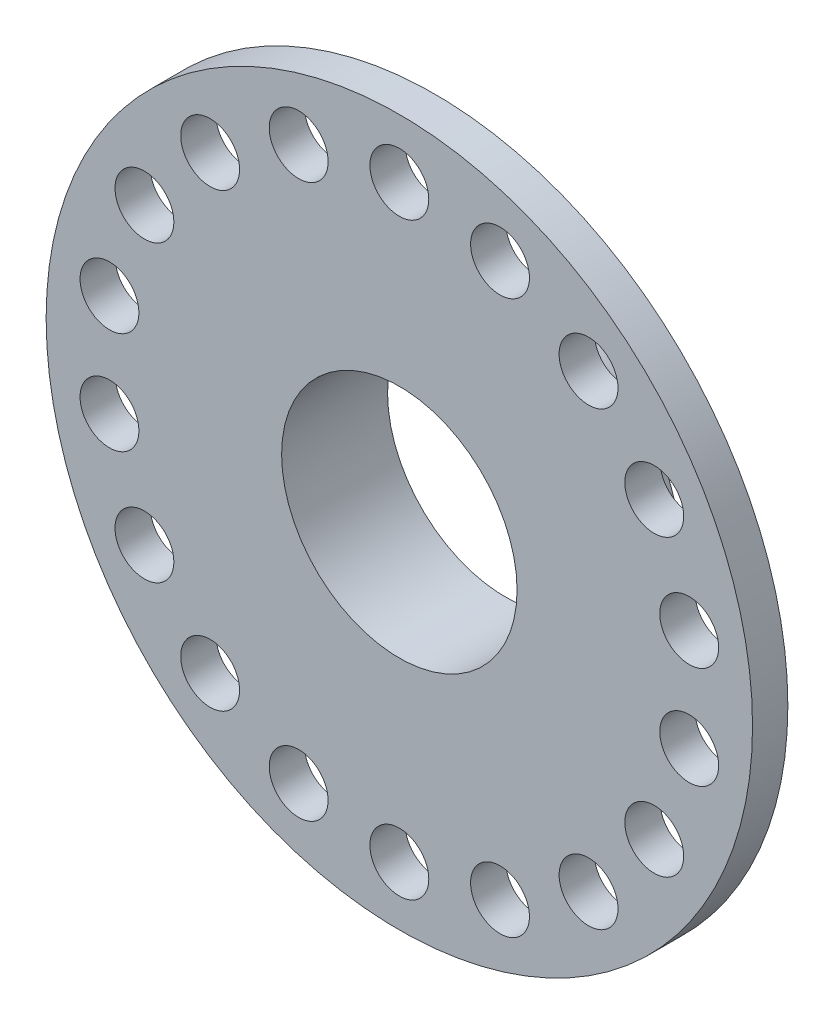
ISO-10303-21;
HEADER;
FILE_DESCRIPTION(('STEP AP214'),'2;1');
FILE_NAME('part.step','',(''),(''),'','','');
FILE_SCHEMA(('AUTOMOTIVE_DESIGN { 1 0 10303 214 1 1 1 1 }'));
ENDSEC;
DATA;
#1=APPLICATION_CONTEXT('core data for automotive mechanical design processes');
#2=APPLICATION_PROTOCOL_DEFINITION('international standard','automotive_design',2000,#1);
#3=PRODUCT_CONTEXT('',#1,'mechanical');
#4=PRODUCT('Part','Part','',(#3));
#5=PRODUCT_RELATED_PRODUCT_CATEGORY('part','',(#4));
#6=PRODUCT_DEFINITION_FORMATION('','',#4);
#7=PRODUCT_DEFINITION_CONTEXT('part definition',#1,'design');
#8=PRODUCT_DEFINITION('design','',#6,#7);
#9=PRODUCT_DEFINITION_SHAPE('','',#8);
#10=(LENGTH_UNIT() NAMED_UNIT(*) SI_UNIT(.MILLI.,.METRE.));
#11=(NAMED_UNIT(*) PLANE_ANGLE_UNIT() SI_UNIT($,.RADIAN.));
#12=(NAMED_UNIT(*) SI_UNIT($,.STERADIAN.) SOLID_ANGLE_UNIT());
#13=UNCERTAINTY_MEASURE_WITH_UNIT(LENGTH_MEASURE(1.E-05),#10,'distance_accuracy_value','');
#14=(GEOMETRIC_REPRESENTATION_CONTEXT(3) GLOBAL_UNCERTAINTY_ASSIGNED_CONTEXT((#13)) GLOBAL_UNIT_ASSIGNED_CONTEXT((#10,
#11,#12)) REPRESENTATION_CONTEXT('',''));
#15=CARTESIAN_POINT('',(0.,0.,0.));
#16=DIRECTION('',(0.,0.,1.));
#17=DIRECTION('',(1.,0.,0.));
#18=AXIS2_PLACEMENT_3D('',#15,#16,#17);
#19=CARTESIAN_POINT('',(0.,0.,6.));
#20=DIRECTION('',(0.,0.,-1.));
#21=DIRECTION('',(-1.,0.,0.));
#22=AXIS2_PLACEMENT_3D('',#19,#20,#21);
#23=CYLINDRICAL_SURFACE('',#22,15.);
#24=CARTESIAN_POINT('',(0.,0.,6.));
#25=DIRECTION('',(0.,0.,1.));
#26=DIRECTION('',(1.,0.,0.));
#27=AXIS2_PLACEMENT_3D('',#24,#25,#26);
#28=CIRCLE('',#27,15.);
#29=CARTESIAN_POINT('',(15.,0.,6.));
#30=VERTEX_POINT('',#29);
#31=EDGE_CURVE('E10',#30,#30,#28,.T.);
#32=ORIENTED_EDGE('',*,*,#31,.F.);
#33=EDGE_LOOP('',(#32));
#34=FACE_BOUND('',#33,.T.);
#35=CARTESIAN_POINT('',(0.,0.,0.));
#36=DIRECTION('',(0.,0.,1.));
#37=DIRECTION('',(1.,0.,0.));
#38=AXIS2_PLACEMENT_3D('',#35,#36,#37);
#39=CIRCLE('',#38,15.);
#40=CARTESIAN_POINT('',(15.,0.,0.));
#41=VERTEX_POINT('',#40);
#42=EDGE_CURVE('E46',#41,#41,#39,.T.);
#43=ORIENTED_EDGE('',*,*,#42,.T.);
#44=EDGE_LOOP('',(#43));
#45=FACE_BOUND('',#44,.T.);
#46=ADVANCED_FACE('F39',(#34,#45),#23,.T.);
#47=CARTESIAN_POINT('',(0.,0.,0.));
#48=DIRECTION('',(0.,0.,1.));
#49=DIRECTION('',(1.,0.,0.));
#50=AXIS2_PLACEMENT_3D('',#47,#48,#49);
#51=PLANE('',#50);
#52=CARTESIAN_POINT('',(0.,0.,0.));
#53=DIRECTION('',(0.,0.,-1.));
#54=DIRECTION('',(-1.,0.,0.));
#55=AXIS2_PLACEMENT_3D('',#52,#53,#54);
#56=CIRCLE('',#55,10.);
#57=CARTESIAN_POINT('',(-10.,0.,0.));
#58=VERTEX_POINT('',#57);
#59=EDGE_CURVE('E110',#58,#58,#56,.T.);
#60=ORIENTED_EDGE('',*,*,#59,.F.);
#61=EDGE_LOOP('',(#60));
#62=FACE_BOUND('',#61,.T.);
#63=ORIENTED_EDGE('',*,*,#42,.F.);
#64=EDGE_LOOP('',(#63));
#65=FACE_BOUND('',#64,.T.);
#66=ADVANCED_FACE('F145',(#62,#65),#51,.F.);
#67=CARTESIAN_POINT('',(0.,0.,9.));
#68=DIRECTION('',(0.,0.,-1.));
#69=DIRECTION('',(-1.,0.,0.));
#70=AXIS2_PLACEMENT_3D('',#67,#68,#69);
#71=CYLINDRICAL_SURFACE('',#70,30.);
#72=CARTESIAN_POINT('',(0.,0.,9.));
#73=DIRECTION('',(0.,0.,1.));
#74=DIRECTION('',(1.,0.,0.));
#75=AXIS2_PLACEMENT_3D('',#72,#73,#74);
#76=CIRCLE('',#75,30.);
#77=CARTESIAN_POINT('',(30.,0.,9.));
#78=VERTEX_POINT('',#77);
#79=EDGE_CURVE('E51',#78,#78,#76,.T.);
#80=ORIENTED_EDGE('',*,*,#79,.F.);
#81=EDGE_LOOP('',(#80));
#82=FACE_BOUND('',#81,.T.);
#83=CARTESIAN_POINT('',(0.,0.,6.));
#84=DIRECTION('',(0.,0.,1.));
#85=DIRECTION('',(1.,0.,0.));
#86=AXIS2_PLACEMENT_3D('',#83,#84,#85);
#87=CIRCLE('',#86,30.);
#88=CARTESIAN_POINT('',(30.,0.,6.));
#89=VERTEX_POINT('',#88);
#90=EDGE_CURVE('E54',#89,#89,#87,.T.);
#91=ORIENTED_EDGE('',*,*,#90,.T.);
#92=EDGE_LOOP('',(#91));
#93=FACE_BOUND('',#92,.T.);
#94=ADVANCED_FACE('F127',(#82,#93),#71,.T.);
#95=CARTESIAN_POINT('',(0.,0.,9.));
#96=DIRECTION('',(0.,0.,1.));
#97=DIRECTION('',(1.,0.,0.));
#98=AXIS2_PLACEMENT_3D('',#95,#96,#97);
#99=PLANE('',#98);
#100=CARTESIAN_POINT('',(8.55050358314173,23.4923155196477,9.));
#101=DIRECTION('',(0.,0.,1.));
#102=DIRECTION('',(1.,0.,0.));
#103=AXIS2_PLACEMENT_3D('',#100,#101,#102);
#104=CIRCLE('',#103,2.5);
#105=CARTESIAN_POINT('',(11.0505035831417,23.4923155196477,9.));
#106=VERTEX_POINT('',#105);
#107=EDGE_CURVE('E417',#106,#106,#104,.T.);
#108=ORIENTED_EDGE('',*,*,#107,.F.);
#109=EDGE_LOOP('',(#108));
#110=FACE_BOUND('',#109,.T.);
#111=CARTESIAN_POINT('',(16.0696902421635,19.1511110779744,9.));
#112=DIRECTION('',(0.,0.,1.));
#113=DIRECTION('',(1.,0.,0.));
#114=AXIS2_PLACEMENT_3D('',#111,#112,#113);
#115=CIRCLE('',#114,2.5);
#116=CARTESIAN_POINT('',(18.5696902421635,19.1511110779744,9.));
#117=VERTEX_POINT('',#116);
#118=EDGE_CURVE('E418',#117,#117,#115,.T.);
#119=ORIENTED_EDGE('',*,*,#118,.F.);
#120=EDGE_LOOP('',(#119));
#121=FACE_BOUND('',#120,.T.);
#122=CARTESIAN_POINT('',(21.650635094611,12.5,9.));
#123=DIRECTION('',(0.,0.,1.));
#124=DIRECTION('',(1.,0.,0.));
#125=AXIS2_PLACEMENT_3D('',#122,#123,#124);
#126=CIRCLE('',#125,2.5);
#127=CARTESIAN_POINT('',(24.150635094611,12.5,9.));
#128=VERTEX_POINT('',#127);
#129=EDGE_CURVE('E422',#128,#128,#126,.T.);
#130=ORIENTED_EDGE('',*,*,#129,.F.);
#131=EDGE_LOOP('',(#130));
#132=FACE_BOUND('',#131,.T.);
#133=CARTESIAN_POINT('',(24.6201938253052,4.34120444167318,9.));
#134=DIRECTION('',(0.,0.,1.));
#135=DIRECTION('',(1.,0.,0.));
#136=AXIS2_PLACEMENT_3D('',#133,#134,#135);
#137=CIRCLE('',#136,2.5);
#138=CARTESIAN_POINT('',(27.1201938253052,4.34120444167318,9.));
#139=VERTEX_POINT('',#138);
#140=EDGE_CURVE('E429',#139,#139,#137,.T.);
#141=ORIENTED_EDGE('',*,*,#140,.F.);
#142=EDGE_LOOP('',(#141));
#143=FACE_BOUND('',#142,.T.);
#144=CARTESIAN_POINT('',(24.6201938253052,-4.34120444167335,9.));
#145=DIRECTION('',(0.,0.,1.));
#146=DIRECTION('',(1.,0.,0.));
#147=AXIS2_PLACEMENT_3D('',#144,#145,#146);
#148=CIRCLE('',#147,2.5);
#149=CARTESIAN_POINT('',(27.1201938253052,-4.34120444167335,9.));
#150=VERTEX_POINT('',#149);
#151=EDGE_CURVE('E432',#150,#150,#148,.T.);
#152=ORIENTED_EDGE('',*,*,#151,.F.);
#153=EDGE_LOOP('',(#152));
#154=FACE_BOUND('',#153,.T.);
#155=CARTESIAN_POINT('',(21.6506350946109,-12.5000000000001,9.));
#156=DIRECTION('',(0.,0.,1.));
#157=DIRECTION('',(1.,0.,0.));
#158=AXIS2_PLACEMENT_3D('',#155,#156,#157);
#159=CIRCLE('',#158,2.5);
#160=CARTESIAN_POINT('',(24.1506350946109,-12.5000000000001,9.));
#161=VERTEX_POINT('',#160);
#162=EDGE_CURVE('E435',#161,#161,#159,.T.);
#163=ORIENTED_EDGE('',*,*,#162,.F.);
#164=EDGE_LOOP('',(#163));
#165=FACE_BOUND('',#164,.T.);
#166=CARTESIAN_POINT('',(16.0696902421634,-19.1511110779745,9.));
#167=DIRECTION('',(0.,0.,1.));
#168=DIRECTION('',(1.,0.,0.));
#169=AXIS2_PLACEMENT_3D('',#166,#167,#168);
#170=CIRCLE('',#169,2.5);
#171=CARTESIAN_POINT('',(18.5696902421634,-19.1511110779745,9.));
#172=VERTEX_POINT('',#171);
#173=EDGE_CURVE('E438',#172,#172,#170,.T.);
#174=ORIENTED_EDGE('',*,*,#173,.F.);
#175=EDGE_LOOP('',(#174));
#176=FACE_BOUND('',#175,.T.);
#177=CARTESIAN_POINT('',(8.55050358314158,-23.4923155196478,9.));
#178=DIRECTION('',(0.,0.,1.));
#179=DIRECTION('',(1.,0.,0.));
#180=AXIS2_PLACEMENT_3D('',#177,#178,#179);
#181=CIRCLE('',#180,2.5);
#182=CARTESIAN_POINT('',(11.0505035831416,-23.4923155196478,9.));
#183=VERTEX_POINT('',#182);
#184=EDGE_CURVE('E441',#183,#183,#181,.T.);
#185=ORIENTED_EDGE('',*,*,#184,.F.);
#186=EDGE_LOOP('',(#185));
#187=FACE_BOUND('',#186,.T.);
#188=CARTESIAN_POINT('',(-1.74574066942157E-13,-25.,9.));
#189=DIRECTION('',(0.,0.,1.));
#190=DIRECTION('',(1.,0.,0.));
#191=AXIS2_PLACEMENT_3D('',#188,#189,#190);
#192=CIRCLE('',#191,2.5);
#193=CARTESIAN_POINT('',(2.49999999999982,-25.,9.));
#194=VERTEX_POINT('',#193);
#195=EDGE_CURVE('E444',#194,#194,#192,.T.);
#196=ORIENTED_EDGE('',*,*,#195,.F.);
#197=EDGE_LOOP('',(#196));
#198=FACE_BOUND('',#197,.T.);
#199=CARTESIAN_POINT('',(-8.5505035831419,-23.4923155196476,9.));
#200=DIRECTION('',(0.,0.,1.));
#201=DIRECTION('',(1.,0.,0.));
#202=AXIS2_PLACEMENT_3D('',#199,#200,#201);
#203=CIRCLE('',#202,2.5);
#204=CARTESIAN_POINT('',(-6.0505035831419,-23.4923155196476,9.));
#205=VERTEX_POINT('',#204);
#206=EDGE_CURVE('E447',#205,#205,#203,.T.);
#207=ORIENTED_EDGE('',*,*,#206,.F.);
#208=EDGE_LOOP('',(#207));
#209=FACE_BOUND('',#208,.T.);
#210=CARTESIAN_POINT('',(-16.0696902421637,-19.1511110779743,9.));
#211=DIRECTION('',(0.,0.,1.));
#212=DIRECTION('',(1.,0.,0.));
#213=AXIS2_PLACEMENT_3D('',#210,#211,#212);
#214=CIRCLE('',#213,2.5);
#215=CARTESIAN_POINT('',(-13.5696902421636,-19.1511110779743,9.));
#216=VERTEX_POINT('',#215);
#217=EDGE_CURVE('E450',#216,#216,#214,.T.);
#218=ORIENTED_EDGE('',*,*,#217,.F.);
#219=EDGE_LOOP('',(#218));
#220=FACE_BOUND('',#219,.T.);
#221=CARTESIAN_POINT('',(-21.6506350946111,-12.4999999999998,9.));
#222=DIRECTION('',(0.,0.,1.));
#223=DIRECTION('',(1.,0.,0.));
#224=AXIS2_PLACEMENT_3D('',#221,#222,#223);
#225=CIRCLE('',#224,2.5);
#226=CARTESIAN_POINT('',(-19.1506350946111,-12.4999999999998,9.));
#227=VERTEX_POINT('',#226);
#228=EDGE_CURVE('E453',#227,#227,#225,.T.);
#229=ORIENTED_EDGE('',*,*,#228,.F.);
#230=EDGE_LOOP('',(#229));
#231=FACE_BOUND('',#230,.T.);
#232=CARTESIAN_POINT('',(-24.6201938253052,-4.34120444167302,9.));
#233=DIRECTION('',(0.,0.,1.));
#234=DIRECTION('',(1.,0.,0.));
#235=AXIS2_PLACEMENT_3D('',#232,#233,#234);
#236=CIRCLE('',#235,2.5);
#237=CARTESIAN_POINT('',(-22.1201938253052,-4.34120444167302,9.));
#238=VERTEX_POINT('',#237);
#239=EDGE_CURVE('E456',#238,#238,#236,.T.);
#240=ORIENTED_EDGE('',*,*,#239,.F.);
#241=EDGE_LOOP('',(#240));
#242=FACE_BOUND('',#241,.T.);
#243=CARTESIAN_POINT('',(-24.6201938253052,4.34120444167351,9.));
#244=DIRECTION('',(0.,0.,1.));
#245=DIRECTION('',(1.,0.,0.));
#246=AXIS2_PLACEMENT_3D('',#243,#244,#245);
#247=CIRCLE('',#246,2.5);
#248=CARTESIAN_POINT('',(-22.1201938253052,4.34120444167351,9.));
#249=VERTEX_POINT('',#248);
#250=EDGE_CURVE('E459',#249,#249,#247,.T.);
#251=ORIENTED_EDGE('',*,*,#250,.F.);
#252=EDGE_LOOP('',(#251));
#253=FACE_BOUND('',#252,.T.);
#254=CARTESIAN_POINT('',(-21.6506350946108,12.5000000000003,9.));
#255=DIRECTION('',(0.,0.,1.));
#256=DIRECTION('',(1.,0.,0.));
#257=AXIS2_PLACEMENT_3D('',#254,#255,#256);
#258=CIRCLE('',#257,2.5);
#259=CARTESIAN_POINT('',(-19.1506350946108,12.5000000000003,9.));
#260=VERTEX_POINT('',#259);
#261=EDGE_CURVE('E462',#260,#260,#258,.T.);
#262=ORIENTED_EDGE('',*,*,#261,.F.);
#263=EDGE_LOOP('',(#262));
#264=FACE_BOUND('',#263,.T.);
#265=CARTESIAN_POINT('',(-16.0696902421633,19.1511110779747,9.));
#266=DIRECTION('',(0.,0.,1.));
#267=DIRECTION('',(1.,0.,0.));
#268=AXIS2_PLACEMENT_3D('',#265,#266,#267);
#269=CIRCLE('',#268,2.5);
#270=CARTESIAN_POINT('',(-13.5696902421633,19.1511110779747,9.));
#271=VERTEX_POINT('',#270);
#272=EDGE_CURVE('E465',#271,#271,#269,.T.);
#273=ORIENTED_EDGE('',*,*,#272,.F.);
#274=EDGE_LOOP('',(#273));
#275=FACE_BOUND('',#274,.T.);
#276=CARTESIAN_POINT('',(-8.55050358314142,23.4923155196478,9.));
#277=DIRECTION('',(0.,0.,1.));
#278=DIRECTION('',(1.,0.,0.));
#279=AXIS2_PLACEMENT_3D('',#276,#277,#278);
#280=CIRCLE('',#279,2.5);
#281=CARTESIAN_POINT('',(-6.05050358314142,23.4923155196478,9.));
#282=VERTEX_POINT('',#281);
#283=EDGE_CURVE('E425',#282,#282,#280,.T.);
#284=ORIENTED_EDGE('',*,*,#283,.F.);
#285=EDGE_LOOP('',(#284));
#286=FACE_BOUND('',#285,.T.);
#287=CARTESIAN_POINT('',(0.,25.,9.));
#288=DIRECTION('',(0.,0.,1.));
#289=DIRECTION('',(1.,0.,0.));
#290=AXIS2_PLACEMENT_3D('',#287,#288,#289);
#291=CIRCLE('',#290,2.5);
#292=CARTESIAN_POINT('',(2.5,25.,9.));
#293=VERTEX_POINT('',#292);
#294=EDGE_CURVE('E61',#293,#293,#291,.T.);
#295=ORIENTED_EDGE('',*,*,#294,.F.);
#296=EDGE_LOOP('',(#295));
#297=FACE_BOUND('',#296,.T.);
#298=CARTESIAN_POINT('',(0.,0.,9.));
#299=DIRECTION('',(0.,0.,-1.));
#300=DIRECTION('',(-1.,0.,0.));
#301=AXIS2_PLACEMENT_3D('',#298,#299,#300);
#302=CIRCLE('',#301,10.);
#303=CARTESIAN_POINT('',(-10.,0.,9.));
#304=VERTEX_POINT('',#303);
#305=EDGE_CURVE('E114',#304,#304,#302,.T.);
#306=ORIENTED_EDGE('',*,*,#305,.T.);
#307=EDGE_LOOP('',(#306));
#308=FACE_BOUND('',#307,.T.);
#309=ORIENTED_EDGE('',*,*,#79,.T.);
#310=EDGE_LOOP('',(#309));
#311=FACE_BOUND('',#310,.T.);
#312=ADVANCED_FACE('F132',(#110,#121,#132,#143,#154,#165,#176,#187,#198,#209,#220,#231,#242,
#253,#264,#275,#286,#297,#308,#311),#99,.T.);
#313=CARTESIAN_POINT('',(0.,0.,6.));
#314=DIRECTION('',(0.,0.,1.));
#315=DIRECTION('',(1.,0.,0.));
#316=AXIS2_PLACEMENT_3D('',#313,#314,#315);
#317=PLANE('',#316);
#318=CARTESIAN_POINT('',(8.55050358314173,23.4923155196477,6.));
#319=DIRECTION('',(0.,0.,1.));
#320=DIRECTION('',(1.,0.,0.));
#321=AXIS2_PLACEMENT_3D('',#318,#319,#320);
#322=CIRCLE('',#321,2.5);
#323=CARTESIAN_POINT('',(11.0505035831417,23.4923155196477,6.));
#324=VERTEX_POINT('',#323);
#325=EDGE_CURVE('E42',#324,#324,#322,.T.);
#326=ORIENTED_EDGE('',*,*,#325,.T.);
#327=EDGE_LOOP('',(#326));
#328=FACE_BOUND('',#327,.T.);
#329=CARTESIAN_POINT('',(16.0696902421635,19.1511110779744,6.));
#330=DIRECTION('',(0.,0.,1.));
#331=DIRECTION('',(1.,0.,0.));
#332=AXIS2_PLACEMENT_3D('',#329,#330,#331);
#333=CIRCLE('',#332,2.5);
#334=CARTESIAN_POINT('',(18.5696902421635,19.1511110779744,6.));
#335=VERTEX_POINT('',#334);
#336=EDGE_CURVE('E105',#335,#335,#333,.T.);
#337=ORIENTED_EDGE('',*,*,#336,.T.);
#338=EDGE_LOOP('',(#337));
#339=FACE_BOUND('',#338,.T.);
#340=CARTESIAN_POINT('',(21.650635094611,12.5,6.));
#341=DIRECTION('',(0.,0.,1.));
#342=DIRECTION('',(1.,0.,0.));
#343=AXIS2_PLACEMENT_3D('',#340,#341,#342);
#344=CIRCLE('',#343,2.5);
#345=CARTESIAN_POINT('',(24.150635094611,12.5,6.));
#346=VERTEX_POINT('',#345);
#347=EDGE_CURVE('E103',#346,#346,#344,.T.);
#348=ORIENTED_EDGE('',*,*,#347,.T.);
#349=EDGE_LOOP('',(#348));
#350=FACE_BOUND('',#349,.T.);
#351=CARTESIAN_POINT('',(24.6201938253052,4.34120444167318,6.));
#352=DIRECTION('',(0.,0.,1.));
#353=DIRECTION('',(1.,0.,0.));
#354=AXIS2_PLACEMENT_3D('',#351,#352,#353);
#355=CIRCLE('',#354,2.5);
#356=CARTESIAN_POINT('',(27.1201938253052,4.34120444167318,6.));
#357=VERTEX_POINT('',#356);
#358=EDGE_CURVE('E100',#357,#357,#355,.T.);
#359=ORIENTED_EDGE('',*,*,#358,.T.);
#360=EDGE_LOOP('',(#359));
#361=FACE_BOUND('',#360,.T.);
#362=CARTESIAN_POINT('',(24.6201938253052,-4.34120444167335,6.));
#363=DIRECTION('',(0.,0.,1.));
#364=DIRECTION('',(1.,0.,0.));
#365=AXIS2_PLACEMENT_3D('',#362,#363,#364);
#366=CIRCLE('',#365,2.5);
#367=CARTESIAN_POINT('',(27.1201938253052,-4.34120444167335,6.));
#368=VERTEX_POINT('',#367);
#369=EDGE_CURVE('E97',#368,#368,#366,.T.);
#370=ORIENTED_EDGE('',*,*,#369,.T.);
#371=EDGE_LOOP('',(#370));
#372=FACE_BOUND('',#371,.T.);
#373=CARTESIAN_POINT('',(21.6506350946109,-12.5000000000001,6.));
#374=DIRECTION('',(0.,0.,1.));
#375=DIRECTION('',(1.,0.,0.));
#376=AXIS2_PLACEMENT_3D('',#373,#374,#375);
#377=CIRCLE('',#376,2.5);
#378=CARTESIAN_POINT('',(24.1506350946109,-12.5000000000001,6.));
#379=VERTEX_POINT('',#378);
#380=EDGE_CURVE('E94',#379,#379,#377,.T.);
#381=ORIENTED_EDGE('',*,*,#380,.T.);
#382=EDGE_LOOP('',(#381));
#383=FACE_BOUND('',#382,.T.);
#384=CARTESIAN_POINT('',(16.0696902421634,-19.1511110779745,6.));
#385=DIRECTION('',(0.,0.,1.));
#386=DIRECTION('',(1.,0.,0.));
#387=AXIS2_PLACEMENT_3D('',#384,#385,#386);
#388=CIRCLE('',#387,2.5);
#389=CARTESIAN_POINT('',(18.5696902421634,-19.1511110779745,6.));
#390=VERTEX_POINT('',#389);
#391=EDGE_CURVE('E91',#390,#390,#388,.T.);
#392=ORIENTED_EDGE('',*,*,#391,.T.);
#393=EDGE_LOOP('',(#392));
#394=FACE_BOUND('',#393,.T.);
#395=CARTESIAN_POINT('',(8.55050358314158,-23.4923155196478,6.));
#396=DIRECTION('',(0.,0.,1.));
#397=DIRECTION('',(1.,0.,0.));
#398=AXIS2_PLACEMENT_3D('',#395,#396,#397);
#399=CIRCLE('',#398,2.5);
#400=CARTESIAN_POINT('',(11.0505035831416,-23.4923155196478,6.));
#401=VERTEX_POINT('',#400);
#402=EDGE_CURVE('E88',#401,#401,#399,.T.);
#403=ORIENTED_EDGE('',*,*,#402,.T.);
#404=EDGE_LOOP('',(#403));
#405=FACE_BOUND('',#404,.T.);
#406=CARTESIAN_POINT('',(-1.74574066942157E-13,-25.,6.));
#407=DIRECTION('',(0.,0.,1.));
#408=DIRECTION('',(1.,0.,0.));
#409=AXIS2_PLACEMENT_3D('',#406,#407,#408);
#410=CIRCLE('',#409,2.5);
#411=CARTESIAN_POINT('',(2.49999999999982,-25.,6.));
#412=VERTEX_POINT('',#411);
#413=EDGE_CURVE('E85',#412,#412,#410,.T.);
#414=ORIENTED_EDGE('',*,*,#413,.T.);
#415=EDGE_LOOP('',(#414));
#416=FACE_BOUND('',#415,.T.);
#417=CARTESIAN_POINT('',(-8.5505035831419,-23.4923155196476,6.));
#418=DIRECTION('',(0.,0.,1.));
#419=DIRECTION('',(1.,0.,0.));
#420=AXIS2_PLACEMENT_3D('',#417,#418,#419);
#421=CIRCLE('',#420,2.5);
#422=CARTESIAN_POINT('',(-6.0505035831419,-23.4923155196476,6.));
#423=VERTEX_POINT('',#422);
#424=EDGE_CURVE('E82',#423,#423,#421,.T.);
#425=ORIENTED_EDGE('',*,*,#424,.T.);
#426=EDGE_LOOP('',(#425));
#427=FACE_BOUND('',#426,.T.);
#428=CARTESIAN_POINT('',(-16.0696902421637,-19.1511110779743,6.));
#429=DIRECTION('',(0.,0.,1.));
#430=DIRECTION('',(1.,0.,0.));
#431=AXIS2_PLACEMENT_3D('',#428,#429,#430);
#432=CIRCLE('',#431,2.5);
#433=CARTESIAN_POINT('',(-13.5696902421636,-19.1511110779743,6.));
#434=VERTEX_POINT('',#433);
#435=EDGE_CURVE('E79',#434,#434,#432,.T.);
#436=ORIENTED_EDGE('',*,*,#435,.T.);
#437=EDGE_LOOP('',(#436));
#438=FACE_BOUND('',#437,.T.);
#439=CARTESIAN_POINT('',(-21.6506350946111,-12.4999999999998,6.));
#440=DIRECTION('',(0.,0.,1.));
#441=DIRECTION('',(1.,0.,0.));
#442=AXIS2_PLACEMENT_3D('',#439,#440,#441);
#443=CIRCLE('',#442,2.5);
#444=CARTESIAN_POINT('',(-19.1506350946111,-12.4999999999998,6.));
#445=VERTEX_POINT('',#444);
#446=EDGE_CURVE('E76',#445,#445,#443,.T.);
#447=ORIENTED_EDGE('',*,*,#446,.T.);
#448=EDGE_LOOP('',(#447));
#449=FACE_BOUND('',#448,.T.);
#450=CARTESIAN_POINT('',(-24.6201938253052,-4.34120444167302,6.));
#451=DIRECTION('',(0.,0.,1.));
#452=DIRECTION('',(1.,0.,0.));
#453=AXIS2_PLACEMENT_3D('',#450,#451,#452);
#454=CIRCLE('',#453,2.5);
#455=CARTESIAN_POINT('',(-22.1201938253052,-4.34120444167302,6.));
#456=VERTEX_POINT('',#455);
#457=EDGE_CURVE('E73',#456,#456,#454,.T.);
#458=ORIENTED_EDGE('',*,*,#457,.T.);
#459=EDGE_LOOP('',(#458));
#460=FACE_BOUND('',#459,.T.);
#461=CARTESIAN_POINT('',(-24.6201938253052,4.34120444167351,6.));
#462=DIRECTION('',(0.,0.,1.));
#463=DIRECTION('',(1.,0.,0.));
#464=AXIS2_PLACEMENT_3D('',#461,#462,#463);
#465=CIRCLE('',#464,2.5);
#466=CARTESIAN_POINT('',(-22.1201938253052,4.34120444167351,6.));
#467=VERTEX_POINT('',#466);
#468=EDGE_CURVE('E70',#467,#467,#465,.T.);
#469=ORIENTED_EDGE('',*,*,#468,.T.);
#470=EDGE_LOOP('',(#469));
#471=FACE_BOUND('',#470,.T.);
#472=CARTESIAN_POINT('',(-21.6506350946108,12.5000000000003,6.));
#473=DIRECTION('',(0.,0.,1.));
#474=DIRECTION('',(1.,0.,0.));
#475=AXIS2_PLACEMENT_3D('',#472,#473,#474);
#476=CIRCLE('',#475,2.5);
#477=CARTESIAN_POINT('',(-19.1506350946108,12.5000000000003,6.));
#478=VERTEX_POINT('',#477);
#479=EDGE_CURVE('E67',#478,#478,#476,.T.);
#480=ORIENTED_EDGE('',*,*,#479,.T.);
#481=EDGE_LOOP('',(#480));
#482=FACE_BOUND('',#481,.T.);
#483=CARTESIAN_POINT('',(-16.0696902421633,19.1511110779747,6.));
#484=DIRECTION('',(0.,0.,1.));
#485=DIRECTION('',(1.,0.,0.));
#486=AXIS2_PLACEMENT_3D('',#483,#484,#485);
#487=CIRCLE('',#486,2.5);
#488=CARTESIAN_POINT('',(-13.5696902421633,19.1511110779747,6.));
#489=VERTEX_POINT('',#488);
#490=EDGE_CURVE('E64',#489,#489,#487,.T.);
#491=ORIENTED_EDGE('',*,*,#490,.T.);
#492=EDGE_LOOP('',(#491));
#493=FACE_BOUND('',#492,.T.);
#494=CARTESIAN_POINT('',(-8.55050358314142,23.4923155196478,6.));
#495=DIRECTION('',(0.,0.,1.));
#496=DIRECTION('',(1.,0.,0.));
#497=AXIS2_PLACEMENT_3D('',#494,#495,#496);
#498=CIRCLE('',#497,2.5);
#499=CARTESIAN_POINT('',(-6.05050358314142,23.4923155196478,6.));
#500=VERTEX_POINT('',#499);
#501=EDGE_CURVE('E60',#500,#500,#498,.T.);
#502=ORIENTED_EDGE('',*,*,#501,.T.);
#503=EDGE_LOOP('',(#502));
#504=FACE_BOUND('',#503,.T.);
#505=CARTESIAN_POINT('',(0.,25.,6.));
#506=DIRECTION('',(0.,0.,1.));
#507=DIRECTION('',(1.,0.,0.));
#508=AXIS2_PLACEMENT_3D('',#505,#506,#507);
#509=CIRCLE('',#508,2.5);
#510=CARTESIAN_POINT('',(2.5,25.,6.));
#511=VERTEX_POINT('',#510);
#512=EDGE_CURVE('E57',#511,#511,#509,.T.);
#513=ORIENTED_EDGE('',*,*,#512,.T.);
#514=EDGE_LOOP('',(#513));
#515=FACE_BOUND('',#514,.T.);
#516=ORIENTED_EDGE('',*,*,#31,.T.);
#517=EDGE_LOOP('',(#516));
#518=FACE_BOUND('',#517,.T.);
#519=ORIENTED_EDGE('',*,*,#90,.F.);
#520=EDGE_LOOP('',(#519));
#521=FACE_BOUND('',#520,.T.);
#522=ADVANCED_FACE('F129',(#328,#339,#350,#361,#372,#383,#394,#405,#416,#427,#438,#449,#460,
#471,#482,#493,#504,#515,#518,#521),#317,.F.);
#523=CARTESIAN_POINT('',(0.,0.,9.));
#524=DIRECTION('',(0.,0.,-1.));
#525=DIRECTION('',(-1.,0.,0.));
#526=AXIS2_PLACEMENT_3D('',#523,#524,#525);
#527=CYLINDRICAL_SURFACE('',#526,10.);
#528=ORIENTED_EDGE('',*,*,#305,.F.);
#529=EDGE_LOOP('',(#528));
#530=FACE_BOUND('',#529,.T.);
#531=ORIENTED_EDGE('',*,*,#59,.T.);
#532=EDGE_LOOP('',(#531));
#533=FACE_BOUND('',#532,.T.);
#534=ADVANCED_FACE('F131',(#530,#533),#527,.F.);
#535=CARTESIAN_POINT('',(0.,25.,0.));
#536=DIRECTION('',(0.,0.,1.));
#537=DIRECTION('',(1.,0.,0.));
#538=AXIS2_PLACEMENT_3D('',#535,#536,#537);
#539=CYLINDRICAL_SURFACE('',#538,2.5);
#540=ORIENTED_EDGE('',*,*,#294,.T.);
#541=EDGE_LOOP('',(#540));
#542=FACE_BOUND('',#541,.T.);
#543=ORIENTED_EDGE('',*,*,#512,.F.);
#544=EDGE_LOOP('',(#543));
#545=FACE_BOUND('',#544,.T.);
#546=ADVANCED_FACE('F138',(#542,#545),#539,.F.);
#547=CARTESIAN_POINT('',(-8.55050358314142,23.4923155196478,0.));
#548=DIRECTION('',(0.,0.,1.));
#549=DIRECTION('',(1.,0.,0.));
#550=AXIS2_PLACEMENT_3D('',#547,#548,#549);
#551=CYLINDRICAL_SURFACE('',#550,2.5);
#552=ORIENTED_EDGE('',*,*,#283,.T.);
#553=EDGE_LOOP('',(#552));
#554=FACE_BOUND('',#553,.T.);
#555=ORIENTED_EDGE('',*,*,#501,.F.);
#556=EDGE_LOOP('',(#555));
#557=FACE_BOUND('',#556,.T.);
#558=ADVANCED_FACE('F182',(#554,#557),#551,.F.);
#559=CARTESIAN_POINT('',(-16.0696902421633,19.1511110779747,0.));
#560=DIRECTION('',(0.,0.,1.));
#561=DIRECTION('',(1.,0.,0.));
#562=AXIS2_PLACEMENT_3D('',#559,#560,#561);
#563=CYLINDRICAL_SURFACE('',#562,2.5);
#564=ORIENTED_EDGE('',*,*,#272,.T.);
#565=EDGE_LOOP('',(#564));
#566=FACE_BOUND('',#565,.T.);
#567=ORIENTED_EDGE('',*,*,#490,.F.);
#568=EDGE_LOOP('',(#567));
#569=FACE_BOUND('',#568,.T.);
#570=ADVANCED_FACE('F193',(#566,#569),#563,.F.);
#571=CARTESIAN_POINT('',(-21.6506350946108,12.5000000000003,0.));
#572=DIRECTION('',(0.,0.,1.));
#573=DIRECTION('',(1.,0.,0.));
#574=AXIS2_PLACEMENT_3D('',#571,#572,#573);
#575=CYLINDRICAL_SURFACE('',#574,2.5);
#576=ORIENTED_EDGE('',*,*,#261,.T.);
#577=EDGE_LOOP('',(#576));
#578=FACE_BOUND('',#577,.T.);
#579=ORIENTED_EDGE('',*,*,#479,.F.);
#580=EDGE_LOOP('',(#579));
#581=FACE_BOUND('',#580,.T.);
#582=ADVANCED_FACE('F204',(#578,#581),#575,.F.);
#583=CARTESIAN_POINT('',(-24.6201938253052,4.34120444167351,0.));
#584=DIRECTION('',(0.,0.,1.));
#585=DIRECTION('',(1.,0.,0.));
#586=AXIS2_PLACEMENT_3D('',#583,#584,#585);
#587=CYLINDRICAL_SURFACE('',#586,2.5);
#588=ORIENTED_EDGE('',*,*,#250,.T.);
#589=EDGE_LOOP('',(#588));
#590=FACE_BOUND('',#589,.T.);
#591=ORIENTED_EDGE('',*,*,#468,.F.);
#592=EDGE_LOOP('',(#591));
#593=FACE_BOUND('',#592,.T.);
#594=ADVANCED_FACE('F215',(#590,#593),#587,.F.);
#595=CARTESIAN_POINT('',(-24.6201938253052,-4.34120444167302,0.));
#596=DIRECTION('',(0.,0.,1.));
#597=DIRECTION('',(1.,0.,0.));
#598=AXIS2_PLACEMENT_3D('',#595,#596,#597);
#599=CYLINDRICAL_SURFACE('',#598,2.5);
#600=ORIENTED_EDGE('',*,*,#239,.T.);
#601=EDGE_LOOP('',(#600));
#602=FACE_BOUND('',#601,.T.);
#603=ORIENTED_EDGE('',*,*,#457,.F.);
#604=EDGE_LOOP('',(#603));
#605=FACE_BOUND('',#604,.T.);
#606=ADVANCED_FACE('F226',(#602,#605),#599,.F.);
#607=CARTESIAN_POINT('',(-21.6506350946111,-12.4999999999998,0.));
#608=DIRECTION('',(0.,0.,1.));
#609=DIRECTION('',(1.,0.,0.));
#610=AXIS2_PLACEMENT_3D('',#607,#608,#609);
#611=CYLINDRICAL_SURFACE('',#610,2.5);
#612=ORIENTED_EDGE('',*,*,#228,.T.);
#613=EDGE_LOOP('',(#612));
#614=FACE_BOUND('',#613,.T.);
#615=ORIENTED_EDGE('',*,*,#446,.F.);
#616=EDGE_LOOP('',(#615));
#617=FACE_BOUND('',#616,.T.);
#618=ADVANCED_FACE('F237',(#614,#617),#611,.F.);
#619=CARTESIAN_POINT('',(-16.0696902421637,-19.1511110779743,0.));
#620=DIRECTION('',(0.,0.,1.));
#621=DIRECTION('',(1.,0.,0.));
#622=AXIS2_PLACEMENT_3D('',#619,#620,#621);
#623=CYLINDRICAL_SURFACE('',#622,2.5);
#624=ORIENTED_EDGE('',*,*,#217,.T.);
#625=EDGE_LOOP('',(#624));
#626=FACE_BOUND('',#625,.T.);
#627=ORIENTED_EDGE('',*,*,#435,.F.);
#628=EDGE_LOOP('',(#627));
#629=FACE_BOUND('',#628,.T.);
#630=ADVANCED_FACE('F248',(#626,#629),#623,.F.);
#631=CARTESIAN_POINT('',(-8.5505035831419,-23.4923155196476,0.));
#632=DIRECTION('',(0.,0.,1.));
#633=DIRECTION('',(1.,0.,0.));
#634=AXIS2_PLACEMENT_3D('',#631,#632,#633);
#635=CYLINDRICAL_SURFACE('',#634,2.5);
#636=ORIENTED_EDGE('',*,*,#206,.T.);
#637=EDGE_LOOP('',(#636));
#638=FACE_BOUND('',#637,.T.);
#639=ORIENTED_EDGE('',*,*,#424,.F.);
#640=EDGE_LOOP('',(#639));
#641=FACE_BOUND('',#640,.T.);
#642=ADVANCED_FACE('F259',(#638,#641),#635,.F.);
#643=CARTESIAN_POINT('',(-1.74574066942157E-13,-25.,0.));
#644=DIRECTION('',(0.,0.,1.));
#645=DIRECTION('',(1.,0.,0.));
#646=AXIS2_PLACEMENT_3D('',#643,#644,#645);
#647=CYLINDRICAL_SURFACE('',#646,2.5);
#648=ORIENTED_EDGE('',*,*,#195,.T.);
#649=EDGE_LOOP('',(#648));
#650=FACE_BOUND('',#649,.T.);
#651=ORIENTED_EDGE('',*,*,#413,.F.);
#652=EDGE_LOOP('',(#651));
#653=FACE_BOUND('',#652,.T.);
#654=ADVANCED_FACE('F270',(#650,#653),#647,.F.);
#655=CARTESIAN_POINT('',(8.55050358314158,-23.4923155196478,0.));
#656=DIRECTION('',(0.,0.,1.));
#657=DIRECTION('',(1.,0.,0.));
#658=AXIS2_PLACEMENT_3D('',#655,#656,#657);
#659=CYLINDRICAL_SURFACE('',#658,2.5);
#660=ORIENTED_EDGE('',*,*,#184,.T.);
#661=EDGE_LOOP('',(#660));
#662=FACE_BOUND('',#661,.T.);
#663=ORIENTED_EDGE('',*,*,#402,.F.);
#664=EDGE_LOOP('',(#663));
#665=FACE_BOUND('',#664,.T.);
#666=ADVANCED_FACE('F281',(#662,#665),#659,.F.);
#667=CARTESIAN_POINT('',(16.0696902421634,-19.1511110779745,0.));
#668=DIRECTION('',(0.,0.,1.));
#669=DIRECTION('',(1.,0.,0.));
#670=AXIS2_PLACEMENT_3D('',#667,#668,#669);
#671=CYLINDRICAL_SURFACE('',#670,2.5);
#672=ORIENTED_EDGE('',*,*,#173,.T.);
#673=EDGE_LOOP('',(#672));
#674=FACE_BOUND('',#673,.T.);
#675=ORIENTED_EDGE('',*,*,#391,.F.);
#676=EDGE_LOOP('',(#675));
#677=FACE_BOUND('',#676,.T.);
#678=ADVANCED_FACE('F292',(#674,#677),#671,.F.);
#679=CARTESIAN_POINT('',(21.6506350946109,-12.5000000000001,0.));
#680=DIRECTION('',(0.,0.,1.));
#681=DIRECTION('',(1.,0.,0.));
#682=AXIS2_PLACEMENT_3D('',#679,#680,#681);
#683=CYLINDRICAL_SURFACE('',#682,2.5);
#684=ORIENTED_EDGE('',*,*,#162,.T.);
#685=EDGE_LOOP('',(#684));
#686=FACE_BOUND('',#685,.T.);
#687=ORIENTED_EDGE('',*,*,#380,.F.);
#688=EDGE_LOOP('',(#687));
#689=FACE_BOUND('',#688,.T.);
#690=ADVANCED_FACE('F303',(#686,#689),#683,.F.);
#691=CARTESIAN_POINT('',(24.6201938253052,-4.34120444167335,0.));
#692=DIRECTION('',(0.,0.,1.));
#693=DIRECTION('',(1.,0.,0.));
#694=AXIS2_PLACEMENT_3D('',#691,#692,#693);
#695=CYLINDRICAL_SURFACE('',#694,2.5);
#696=ORIENTED_EDGE('',*,*,#151,.T.);
#697=EDGE_LOOP('',(#696));
#698=FACE_BOUND('',#697,.T.);
#699=ORIENTED_EDGE('',*,*,#369,.F.);
#700=EDGE_LOOP('',(#699));
#701=FACE_BOUND('',#700,.T.);
#702=ADVANCED_FACE('F314',(#698,#701),#695,.F.);
#703=CARTESIAN_POINT('',(24.6201938253052,4.34120444167318,0.));
#704=DIRECTION('',(0.,0.,1.));
#705=DIRECTION('',(1.,0.,0.));
#706=AXIS2_PLACEMENT_3D('',#703,#704,#705);
#707=CYLINDRICAL_SURFACE('',#706,2.5);
#708=ORIENTED_EDGE('',*,*,#140,.T.);
#709=EDGE_LOOP('',(#708));
#710=FACE_BOUND('',#709,.T.);
#711=ORIENTED_EDGE('',*,*,#358,.F.);
#712=EDGE_LOOP('',(#711));
#713=FACE_BOUND('',#712,.T.);
#714=ADVANCED_FACE('F325',(#710,#713),#707,.F.);
#715=CARTESIAN_POINT('',(21.650635094611,12.5,0.));
#716=DIRECTION('',(0.,0.,1.));
#717=DIRECTION('',(1.,0.,0.));
#718=AXIS2_PLACEMENT_3D('',#715,#716,#717);
#719=CYLINDRICAL_SURFACE('',#718,2.5);
#720=ORIENTED_EDGE('',*,*,#129,.T.);
#721=EDGE_LOOP('',(#720));
#722=FACE_BOUND('',#721,.T.);
#723=ORIENTED_EDGE('',*,*,#347,.F.);
#724=EDGE_LOOP('',(#723));
#725=FACE_BOUND('',#724,.T.);
#726=ADVANCED_FACE('F336',(#722,#725),#719,.F.);
#727=CARTESIAN_POINT('',(16.0696902421635,19.1511110779744,0.));
#728=DIRECTION('',(0.,0.,1.));
#729=DIRECTION('',(1.,0.,0.));
#730=AXIS2_PLACEMENT_3D('',#727,#728,#729);
#731=CYLINDRICAL_SURFACE('',#730,2.5);
#732=ORIENTED_EDGE('',*,*,#118,.T.);
#733=EDGE_LOOP('',(#732));
#734=FACE_BOUND('',#733,.T.);
#735=ORIENTED_EDGE('',*,*,#336,.F.);
#736=EDGE_LOOP('',(#735));
#737=FACE_BOUND('',#736,.T.);
#738=ADVANCED_FACE('F347',(#734,#737),#731,.F.);
#739=CARTESIAN_POINT('',(8.55050358314173,23.4923155196477,0.));
#740=DIRECTION('',(0.,0.,1.));
#741=DIRECTION('',(1.,0.,0.));
#742=AXIS2_PLACEMENT_3D('',#739,#740,#741);
#743=CYLINDRICAL_SURFACE('',#742,2.5);
#744=ORIENTED_EDGE('',*,*,#107,.T.);
#745=EDGE_LOOP('',(#744));
#746=FACE_BOUND('',#745,.T.);
#747=ORIENTED_EDGE('',*,*,#325,.F.);
#748=EDGE_LOOP('',(#747));
#749=FACE_BOUND('',#748,.T.);
#750=ADVANCED_FACE('F358',(#746,#749),#743,.F.);
#751=CLOSED_SHELL('',(#46,#66,#94,#312,#522,#534,#546,#558,#570,#582,#594,#606,#618,#630,#642,
#654,#666,#678,#690,#702,#714,#726,#738,#750));
#752=MANIFOLD_SOLID_BREP('B2',#751);
#753=ADVANCED_BREP_SHAPE_REPRESENTATION('',(#18,#752),#14);
#754=SHAPE_DEFINITION_REPRESENTATION(#9,#753);
ENDSEC;
END-ISO-10303-21;
